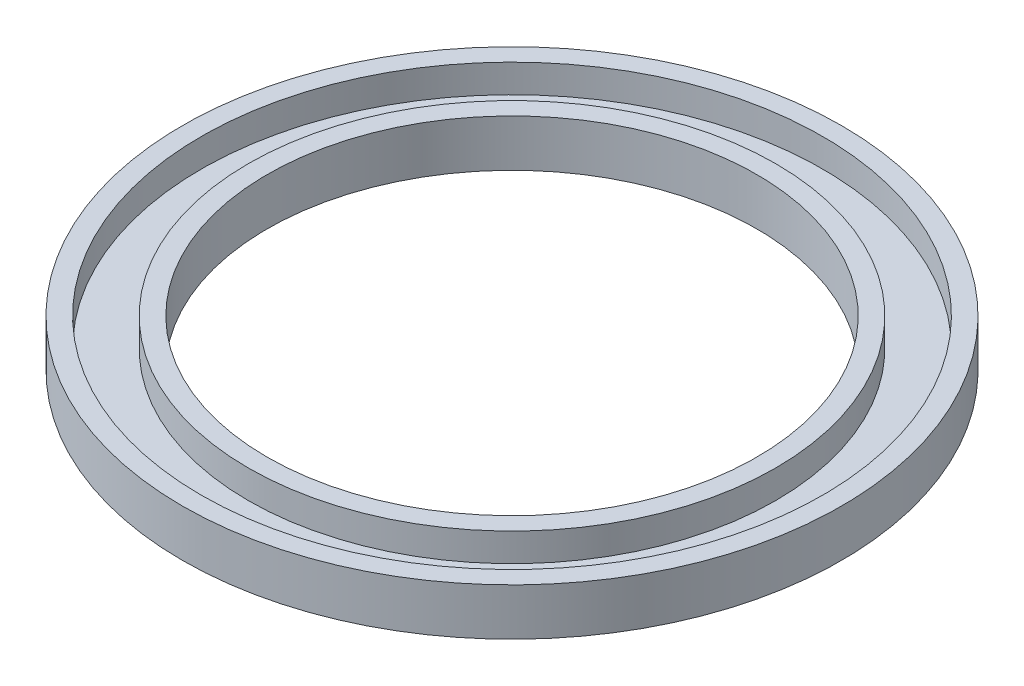
ISO-10303-21;
HEADER;
FILE_DESCRIPTION(('STEP AP214'),'2;1');
FILE_NAME('part.step','',(''),(''),'','','');
FILE_SCHEMA(('AUTOMOTIVE_DESIGN { 1 0 10303 214 1 1 1 1 }'));
ENDSEC;
DATA;
#1=APPLICATION_CONTEXT('core data for automotive mechanical design processes');
#2=APPLICATION_PROTOCOL_DEFINITION('international standard','automotive_design',2000,#1);
#3=PRODUCT_CONTEXT('',#1,'mechanical');
#4=PRODUCT('Part','Part','',(#3));
#5=PRODUCT_RELATED_PRODUCT_CATEGORY('part','',(#4));
#6=PRODUCT_DEFINITION_FORMATION('','',#4);
#7=PRODUCT_DEFINITION_CONTEXT('part definition',#1,'design');
#8=PRODUCT_DEFINITION('design','',#6,#7);
#9=PRODUCT_DEFINITION_SHAPE('','',#8);
#10=(LENGTH_UNIT() NAMED_UNIT(*) SI_UNIT(.MILLI.,.METRE.));
#11=(NAMED_UNIT(*) PLANE_ANGLE_UNIT() SI_UNIT($,.RADIAN.));
#12=(NAMED_UNIT(*) SI_UNIT($,.STERADIAN.) SOLID_ANGLE_UNIT());
#13=UNCERTAINTY_MEASURE_WITH_UNIT(LENGTH_MEASURE(1.E-05),#10,'distance_accuracy_value','');
#14=(GEOMETRIC_REPRESENTATION_CONTEXT(3) GLOBAL_UNCERTAINTY_ASSIGNED_CONTEXT((#13)) GLOBAL_UNIT_ASSIGNED_CONTEXT((#10,
#11,#12)) REPRESENTATION_CONTEXT('',''));
#15=CARTESIAN_POINT('',(0.,0.,0.));
#16=DIRECTION('',(0.,0.,1.));
#17=DIRECTION('',(1.,0.,0.));
#18=AXIS2_PLACEMENT_3D('',#15,#16,#17);
#19=CARTESIAN_POINT('',(0.,2.5,0.));
#20=DIRECTION('',(0.,1.,0.));
#21=DIRECTION('',(0.,0.,1.));
#22=AXIS2_PLACEMENT_3D('',#19,#20,#21);
#23=PLANE('',#22);
#24=CARTESIAN_POINT('',(0.,2.5,0.));
#25=DIRECTION('',(0.,1.,0.));
#26=DIRECTION('',(0.,0.,1.));
#27=AXIS2_PLACEMENT_3D('',#24,#25,#26);
#28=CIRCLE('',#27,13.);
#29=CARTESIAN_POINT('',(0.,2.5,13.));
#30=VERTEX_POINT('',#29);
#31=EDGE_CURVE('E52',#30,#30,#28,.T.);
#32=ORIENTED_EDGE('',*,*,#31,.F.);
#33=EDGE_LOOP('',(#32));
#34=FACE_BOUND('',#33,.T.);
#35=CARTESIAN_POINT('',(0.,2.5,0.));
#36=DIRECTION('',(0.,1.,0.));
#37=DIRECTION('',(0.,0.,1.));
#38=AXIS2_PLACEMENT_3D('',#35,#36,#37);
#39=CIRCLE('',#38,14.);
#40=CARTESIAN_POINT('',(0.,2.5,14.));
#41=VERTEX_POINT('',#40);
#42=EDGE_CURVE('E68',#41,#41,#39,.T.);
#43=ORIENTED_EDGE('',*,*,#42,.T.);
#44=EDGE_LOOP('',(#43));
#45=FACE_BOUND('',#44,.T.);
#46=ADVANCED_FACE('F37',(#34,#45),#23,.T.);
#47=CARTESIAN_POINT('',(0.,2.5,0.));
#48=DIRECTION('',(0.,-1.,0.));
#49=DIRECTION('',(0.,0.,-1.));
#50=AXIS2_PLACEMENT_3D('',#47,#48,#49);
#51=CYLINDRICAL_SURFACE('',#50,17.5);
#52=CARTESIAN_POINT('',(0.,2.5,0.));
#53=DIRECTION('',(0.,1.,0.));
#54=DIRECTION('',(0.,0.,1.));
#55=AXIS2_PLACEMENT_3D('',#52,#53,#54);
#56=CIRCLE('',#55,17.5);
#57=CARTESIAN_POINT('',(0.,2.5,17.5));
#58=VERTEX_POINT('',#57);
#59=EDGE_CURVE('E10',#58,#58,#56,.T.);
#60=ORIENTED_EDGE('',*,*,#59,.F.);
#61=EDGE_LOOP('',(#60));
#62=FACE_BOUND('',#61,.T.);
#63=CARTESIAN_POINT('',(0.,0.,0.));
#64=DIRECTION('',(0.,1.,0.));
#65=DIRECTION('',(0.,0.,1.));
#66=AXIS2_PLACEMENT_3D('',#63,#64,#65);
#67=CIRCLE('',#66,17.5);
#68=CARTESIAN_POINT('',(0.,0.,17.5));
#69=VERTEX_POINT('',#68);
#70=EDGE_CURVE('E41',#69,#69,#67,.T.);
#71=ORIENTED_EDGE('',*,*,#70,.T.);
#72=EDGE_LOOP('',(#71));
#73=FACE_BOUND('',#72,.T.);
#74=ADVANCED_FACE('F39',(#62,#73),#51,.T.);
#75=CARTESIAN_POINT('',(0.,2.5,0.));
#76=DIRECTION('',(0.,1.,0.));
#77=DIRECTION('',(0.,0.,1.));
#78=AXIS2_PLACEMENT_3D('',#75,#76,#77);
#79=CIRCLE('',#78,16.5);
#80=CARTESIAN_POINT('',(0.,2.5,16.5));
#81=VERTEX_POINT('',#80);
#82=EDGE_CURVE('E60',#81,#81,#79,.T.);
#83=ORIENTED_EDGE('',*,*,#82,.F.);
#84=EDGE_LOOP('',(#83));
#85=FACE_BOUND('',#84,.T.);
#86=ORIENTED_EDGE('',*,*,#59,.T.);
#87=EDGE_LOOP('',(#86));
#88=FACE_BOUND('',#87,.T.);
#89=ADVANCED_FACE('F92',(#85,#88),#23,.T.);
#90=CARTESIAN_POINT('',(0.,0.,0.));
#91=DIRECTION('',(0.,1.,0.));
#92=DIRECTION('',(0.,0.,1.));
#93=AXIS2_PLACEMENT_3D('',#90,#91,#92);
#94=PLANE('',#93);
#95=CARTESIAN_POINT('',(0.,0.,0.));
#96=DIRECTION('',(0.,1.,0.));
#97=DIRECTION('',(0.,0.,1.));
#98=AXIS2_PLACEMENT_3D('',#95,#96,#97);
#99=CIRCLE('',#98,13.);
#100=CARTESIAN_POINT('',(0.,0.,13.));
#101=VERTEX_POINT('',#100);
#102=EDGE_CURVE('E50',#101,#101,#99,.T.);
#103=ORIENTED_EDGE('',*,*,#102,.T.);
#104=EDGE_LOOP('',(#103));
#105=FACE_BOUND('',#104,.T.);
#106=ORIENTED_EDGE('',*,*,#70,.F.);
#107=EDGE_LOOP('',(#106));
#108=FACE_BOUND('',#107,.T.);
#109=ADVANCED_FACE('F94',(#105,#108),#94,.F.);
#110=CARTESIAN_POINT('',(0.,0.,0.));
#111=DIRECTION('',(0.,1.,0.));
#112=DIRECTION('',(0.,0.,1.));
#113=AXIS2_PLACEMENT_3D('',#110,#111,#112);
#114=CYLINDRICAL_SURFACE('',#113,13.);
#115=ORIENTED_EDGE('',*,*,#102,.F.);
#116=EDGE_LOOP('',(#115));
#117=FACE_BOUND('',#116,.T.);
#118=ORIENTED_EDGE('',*,*,#31,.T.);
#119=EDGE_LOOP('',(#118));
#120=FACE_BOUND('',#119,.T.);
#121=ADVANCED_FACE('F88',(#117,#120),#114,.F.);
#122=CARTESIAN_POINT('',(0.,1.,0.));
#123=DIRECTION('',(0.,1.,0.));
#124=DIRECTION('',(0.,0.,1.));
#125=AXIS2_PLACEMENT_3D('',#122,#123,#124);
#126=CYLINDRICAL_SURFACE('',#125,16.5);
#127=CARTESIAN_POINT('',(0.,1.,0.));
#128=DIRECTION('',(0.,1.,0.));
#129=DIRECTION('',(0.,0.,1.));
#130=AXIS2_PLACEMENT_3D('',#127,#128,#129);
#131=CIRCLE('',#130,16.5);
#132=CARTESIAN_POINT('',(0.,1.,16.5));
#133=VERTEX_POINT('',#132);
#134=EDGE_CURVE('E56',#133,#133,#131,.T.);
#135=ORIENTED_EDGE('',*,*,#134,.F.);
#136=EDGE_LOOP('',(#135));
#137=FACE_BOUND('',#136,.T.);
#138=ORIENTED_EDGE('',*,*,#82,.T.);
#139=EDGE_LOOP('',(#138));
#140=FACE_BOUND('',#139,.T.);
#141=ADVANCED_FACE('F82',(#137,#140),#126,.F.);
#142=CARTESIAN_POINT('',(0.,1.,0.));
#143=DIRECTION('',(0.,1.,0.));
#144=DIRECTION('',(0.,0.,1.));
#145=AXIS2_PLACEMENT_3D('',#142,#143,#144);
#146=PLANE('',#145);
#147=CARTESIAN_POINT('',(0.,1.,0.));
#148=DIRECTION('',(0.,1.,0.));
#149=DIRECTION('',(0.,0.,1.));
#150=AXIS2_PLACEMENT_3D('',#147,#148,#149);
#151=CIRCLE('',#150,14.);
#152=CARTESIAN_POINT('',(0.,1.,14.));
#153=VERTEX_POINT('',#152);
#154=EDGE_CURVE('E64',#153,#153,#151,.T.);
#155=ORIENTED_EDGE('',*,*,#154,.F.);
#156=EDGE_LOOP('',(#155));
#157=FACE_BOUND('',#156,.T.);
#158=ORIENTED_EDGE('',*,*,#134,.T.);
#159=EDGE_LOOP('',(#158));
#160=FACE_BOUND('',#159,.T.);
#161=ADVANCED_FACE('F79',(#157,#160),#146,.T.);
#162=CARTESIAN_POINT('',(0.,1.,0.));
#163=DIRECTION('',(0.,1.,0.));
#164=DIRECTION('',(0.,0.,1.));
#165=AXIS2_PLACEMENT_3D('',#162,#163,#164);
#166=CYLINDRICAL_SURFACE('',#165,14.);
#167=ORIENTED_EDGE('',*,*,#154,.T.);
#168=EDGE_LOOP('',(#167));
#169=FACE_BOUND('',#168,.T.);
#170=ORIENTED_EDGE('',*,*,#42,.F.);
#171=EDGE_LOOP('',(#170));
#172=FACE_BOUND('',#171,.T.);
#173=ADVANCED_FACE('F76',(#169,#172),#166,.T.);
#174=CLOSED_SHELL('',(#46,#74,#89,#109,#121,#141,#161,#173));
#175=MANIFOLD_SOLID_BREP('B2',#174);
#176=ADVANCED_BREP_SHAPE_REPRESENTATION('',(#18,#175),#14);
#177=SHAPE_DEFINITION_REPRESENTATION(#9,#176);
ENDSEC;
END-ISO-10303-21;
